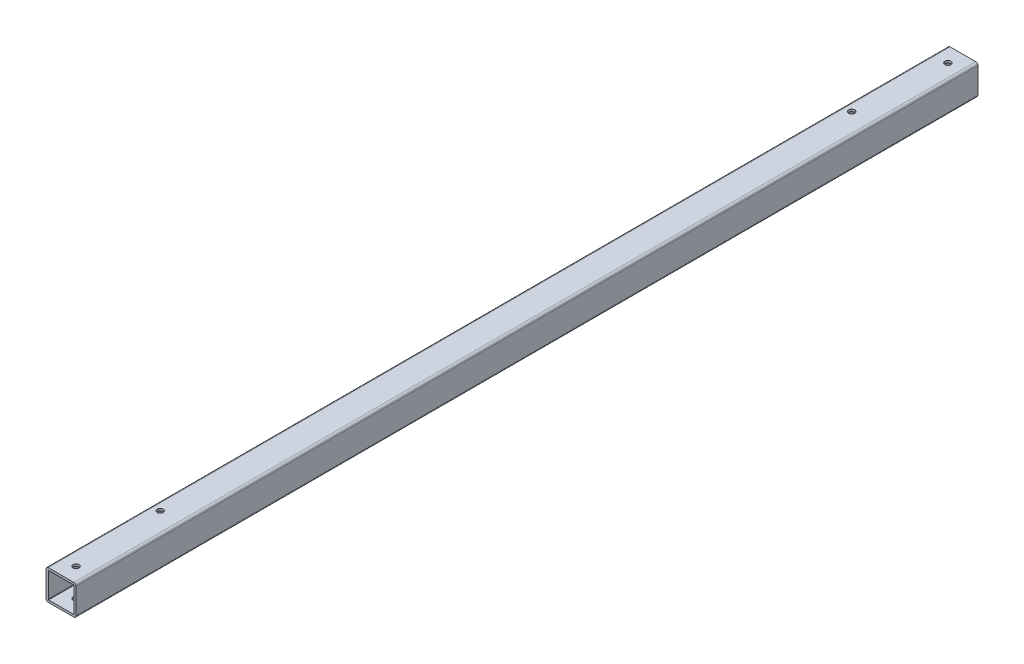
ISO-10303-21;
HEADER;
FILE_DESCRIPTION(('STEP AP214'),'2;1');
FILE_NAME('part.step','',(''),(''),'','','');
FILE_SCHEMA(('AUTOMOTIVE_DESIGN { 1 0 10303 214 1 1 1 1 }'));
ENDSEC;
DATA;
#1=APPLICATION_CONTEXT('core data for automotive mechanical design processes');
#2=APPLICATION_PROTOCOL_DEFINITION('international standard','automotive_design',2000,#1);
#3=PRODUCT_CONTEXT('',#1,'mechanical');
#4=PRODUCT('Part','Part','',(#3));
#5=PRODUCT_RELATED_PRODUCT_CATEGORY('part','',(#4));
#6=PRODUCT_DEFINITION_FORMATION('','',#4);
#7=PRODUCT_DEFINITION_CONTEXT('part definition',#1,'design');
#8=PRODUCT_DEFINITION('design','',#6,#7);
#9=PRODUCT_DEFINITION_SHAPE('','',#8);
#10=(LENGTH_UNIT() NAMED_UNIT(*) SI_UNIT(.MILLI.,.METRE.));
#11=(NAMED_UNIT(*) PLANE_ANGLE_UNIT() SI_UNIT($,.RADIAN.));
#12=(NAMED_UNIT(*) SI_UNIT($,.STERADIAN.) SOLID_ANGLE_UNIT());
#13=UNCERTAINTY_MEASURE_WITH_UNIT(LENGTH_MEASURE(1.E-05),#10,'distance_accuracy_value','');
#14=(GEOMETRIC_REPRESENTATION_CONTEXT(3) GLOBAL_UNCERTAINTY_ASSIGNED_CONTEXT((#13)) GLOBAL_UNIT_ASSIGNED_CONTEXT((#10,
#11,#12)) REPRESENTATION_CONTEXT('',''));
#15=CARTESIAN_POINT('',(0.,0.,0.));
#16=DIRECTION('',(0.,0.,1.));
#17=DIRECTION('',(1.,0.,0.));
#18=AXIS2_PLACEMENT_3D('',#15,#16,#17);
#19=CARTESIAN_POINT('',(-3.33066907387547E-13,0.,1200.));
#20=DIRECTION('',(0.,0.,1.));
#21=DIRECTION('',(1.,0.,0.));
#22=AXIS2_PLACEMENT_3D('',#19,#20,#21);
#23=PLANE('',#22);
#24=DIRECTION('',(1.,0.,0.));
#25=VECTOR('',#24,1.);
#26=CARTESIAN_POINT('',(-20.0000000000002,-20.,1200.));
#27=LINE('',#26,#25);
#28=CARTESIAN_POINT('',(-17.0000000000003,-20.,1200.));
#29=VERTEX_POINT('',#28);
#30=CARTESIAN_POINT('',(16.9999999999997,-20.,1200.));
#31=VERTEX_POINT('',#30);
#32=EDGE_CURVE('E210',#29,#31,#27,.T.);
#33=ORIENTED_EDGE('',*,*,#32,.T.);
#34=CARTESIAN_POINT('',(16.9999999999997,-17.,1200.));
#35=DIRECTION('',(0.,0.,1.));
#36=DIRECTION('',(1.,0.,0.));
#37=AXIS2_PLACEMENT_3D('',#34,#35,#36);
#38=CIRCLE('',#37,3.);
#39=CARTESIAN_POINT('',(19.9999999999997,-17.,1200.));
#40=VERTEX_POINT('',#39);
#41=EDGE_CURVE('E269',#31,#40,#38,.T.);
#42=ORIENTED_EDGE('',*,*,#41,.T.);
#43=DIRECTION('',(0.,1.,0.));
#44=VECTOR('',#43,1.);
#45=CARTESIAN_POINT('',(19.9999999999997,20.,1200.));
#46=LINE('',#45,#44);
#47=CARTESIAN_POINT('',(19.9999999999997,17.,1200.));
#48=VERTEX_POINT('',#47);
#49=EDGE_CURVE('E288',#40,#48,#46,.T.);
#50=ORIENTED_EDGE('',*,*,#49,.T.);
#51=CARTESIAN_POINT('',(16.9999999999997,17.,1200.));
#52=DIRECTION('',(0.,0.,1.));
#53=DIRECTION('',(1.,0.,0.));
#54=AXIS2_PLACEMENT_3D('',#51,#52,#53);
#55=CIRCLE('',#54,3.);
#56=CARTESIAN_POINT('',(16.9999999999997,20.,1200.));
#57=VERTEX_POINT('',#56);
#58=EDGE_CURVE('E265',#48,#57,#55,.T.);
#59=ORIENTED_EDGE('',*,*,#58,.T.);
#60=DIRECTION('',(-1.,0.,0.));
#61=VECTOR('',#60,1.);
#62=CARTESIAN_POINT('',(-20.0000000000004,20.,1200.));
#63=LINE('',#62,#61);
#64=CARTESIAN_POINT('',(-17.0000000000003,20.,1200.));
#65=VERTEX_POINT('',#64);
#66=EDGE_CURVE('E280',#57,#65,#63,.T.);
#67=ORIENTED_EDGE('',*,*,#66,.T.);
#68=CARTESIAN_POINT('',(-17.0000000000003,17.,1200.));
#69=DIRECTION('',(0.,0.,1.));
#70=DIRECTION('',(1.,0.,0.));
#71=AXIS2_PLACEMENT_3D('',#68,#69,#70);
#72=CIRCLE('',#71,3.);
#73=CARTESIAN_POINT('',(-20.0000000000004,17.,1200.));
#74=VERTEX_POINT('',#73);
#75=EDGE_CURVE('E91',#65,#74,#72,.T.);
#76=ORIENTED_EDGE('',*,*,#75,.T.);
#77=DIRECTION('',(0.,-1.,0.));
#78=VECTOR('',#77,1.);
#79=CARTESIAN_POINT('',(-20.0000000000004,20.,1200.));
#80=LINE('',#79,#78);
#81=CARTESIAN_POINT('',(-20.0000000000002,-17.,1200.));
#82=VERTEX_POINT('',#81);
#83=EDGE_CURVE('E215',#74,#82,#80,.T.);
#84=ORIENTED_EDGE('',*,*,#83,.T.);
#85=CARTESIAN_POINT('',(-17.0000000000003,-17.,1200.));
#86=DIRECTION('',(0.,0.,1.));
#87=DIRECTION('',(1.,0.,0.));
#88=AXIS2_PLACEMENT_3D('',#85,#86,#87);
#89=CIRCLE('',#88,3.);
#90=EDGE_CURVE('E267',#82,#29,#89,.T.);
#91=ORIENTED_EDGE('',*,*,#90,.T.);
#92=EDGE_LOOP('',(#33,#42,#50,#59,#67,#76,#84,#91));
#93=FACE_BOUND('',#92,.T.);
#94=DIRECTION('',(-1.,0.,0.));
#95=VECTOR('',#94,1.);
#96=CARTESIAN_POINT('',(-20.0000000000004,17.,1200.));
#97=LINE('',#96,#95);
#98=CARTESIAN_POINT('',(16.4999999999997,17.,1200.));
#99=VERTEX_POINT('',#98);
#100=CARTESIAN_POINT('',(-16.5000000000003,17.,1200.));
#101=VERTEX_POINT('',#100);
#102=EDGE_CURVE('E317',#99,#101,#97,.T.);
#103=ORIENTED_EDGE('',*,*,#102,.F.);
#104=CARTESIAN_POINT('',(16.4999999999997,16.5,1200.));
#105=DIRECTION('',(0.,0.,1.));
#106=DIRECTION('',(1.,0.,0.));
#107=AXIS2_PLACEMENT_3D('',#104,#105,#106);
#108=CIRCLE('',#107,0.5);
#109=CARTESIAN_POINT('',(16.9999999999997,16.5,1200.));
#110=VERTEX_POINT('',#109);
#111=EDGE_CURVE('E240',#99,#110,#108,.F.);
#112=ORIENTED_EDGE('',*,*,#111,.T.);
#113=DIRECTION('',(0.,1.,0.));
#114=VECTOR('',#113,1.);
#115=CARTESIAN_POINT('',(16.9999999999997,20.,1200.));
#116=LINE('',#115,#114);
#117=CARTESIAN_POINT('',(16.9999999999997,-16.5,1200.));
#118=VERTEX_POINT('',#117);
#119=EDGE_CURVE('E306',#118,#110,#116,.T.);
#120=ORIENTED_EDGE('',*,*,#119,.F.);
#121=CARTESIAN_POINT('',(16.4999999999997,-16.5,1200.));
#122=DIRECTION('',(0.,0.,1.));
#123=DIRECTION('',(1.,0.,0.));
#124=AXIS2_PLACEMENT_3D('',#121,#122,#123);
#125=CIRCLE('',#124,0.5);
#126=CARTESIAN_POINT('',(16.4999999999997,-17.,1200.));
#127=VERTEX_POINT('',#126);
#128=EDGE_CURVE('E244',#118,#127,#125,.F.);
#129=ORIENTED_EDGE('',*,*,#128,.T.);
#130=DIRECTION('',(1.,0.,0.));
#131=VECTOR('',#130,1.);
#132=CARTESIAN_POINT('',(-20.0000000000002,-17.,1200.));
#133=LINE('',#132,#131);
#134=CARTESIAN_POINT('',(-16.5000000000003,-17.,1200.));
#135=VERTEX_POINT('',#134);
#136=EDGE_CURVE('E302',#135,#127,#133,.T.);
#137=ORIENTED_EDGE('',*,*,#136,.F.);
#138=CARTESIAN_POINT('',(-16.5000000000003,-16.5,1200.));
#139=DIRECTION('',(0.,0.,1.));
#140=DIRECTION('',(1.,0.,0.));
#141=AXIS2_PLACEMENT_3D('',#138,#139,#140);
#142=CIRCLE('',#141,0.5);
#143=CARTESIAN_POINT('',(-17.0000000000003,-16.5,1200.));
#144=VERTEX_POINT('',#143);
#145=EDGE_CURVE('E196',#135,#144,#142,.F.);
#146=ORIENTED_EDGE('',*,*,#145,.T.);
#147=DIRECTION('',(0.,-1.,0.));
#148=VECTOR('',#147,1.);
#149=CARTESIAN_POINT('',(-17.0000000000003,20.,1200.));
#150=LINE('',#149,#148);
#151=CARTESIAN_POINT('',(-17.0000000000003,16.5,1200.));
#152=VERTEX_POINT('',#151);
#153=EDGE_CURVE('E315',#152,#144,#150,.T.);
#154=ORIENTED_EDGE('',*,*,#153,.F.);
#155=CARTESIAN_POINT('',(-16.5000000000003,16.5,1200.));
#156=DIRECTION('',(0.,0.,1.));
#157=DIRECTION('',(1.,0.,0.));
#158=AXIS2_PLACEMENT_3D('',#155,#156,#157);
#159=CIRCLE('',#158,0.5);
#160=EDGE_CURVE('E195',#152,#101,#159,.F.);
#161=ORIENTED_EDGE('',*,*,#160,.T.);
#162=EDGE_LOOP('',(#103,#112,#120,#129,#137,#146,#154,#161));
#163=FACE_BOUND('',#162,.T.);
#164=ADVANCED_FACE('F68',(#93,#163),#23,.T.);
#165=CARTESIAN_POINT('',(0.,0.,0.));
#166=DIRECTION('',(0.,0.,1.));
#167=DIRECTION('',(1.,0.,0.));
#168=AXIS2_PLACEMENT_3D('',#165,#166,#167);
#169=PLANE('',#168);
#170=DIRECTION('',(0.,1.,0.));
#171=VECTOR('',#170,1.);
#172=CARTESIAN_POINT('',(20.,20.,0.));
#173=LINE('',#172,#171);
#174=CARTESIAN_POINT('',(20.,-17.,0.));
#175=VERTEX_POINT('',#174);
#176=CARTESIAN_POINT('',(20.,17.,0.));
#177=VERTEX_POINT('',#176);
#178=EDGE_CURVE('E298',#175,#177,#173,.T.);
#179=ORIENTED_EDGE('',*,*,#178,.F.);
#180=CARTESIAN_POINT('',(17.,-17.,0.));
#181=DIRECTION('',(0.,0.,1.));
#182=DIRECTION('',(1.,0.,0.));
#183=AXIS2_PLACEMENT_3D('',#180,#181,#182);
#184=CIRCLE('',#183,3.);
#185=CARTESIAN_POINT('',(17.,-20.,0.));
#186=VERTEX_POINT('',#185);
#187=EDGE_CURVE('E257',#175,#186,#184,.F.);
#188=ORIENTED_EDGE('',*,*,#187,.T.);
#189=DIRECTION('',(1.,0.,0.));
#190=VECTOR('',#189,1.);
#191=CARTESIAN_POINT('',(-20.,-20.,0.));
#192=LINE('',#191,#190);
#193=CARTESIAN_POINT('',(-17.,-20.,0.));
#194=VERTEX_POINT('',#193);
#195=EDGE_CURVE('E218',#194,#186,#192,.T.);
#196=ORIENTED_EDGE('',*,*,#195,.F.);
#197=CARTESIAN_POINT('',(-17.,-17.,0.));
#198=DIRECTION('',(0.,0.,1.));
#199=DIRECTION('',(1.,0.,0.));
#200=AXIS2_PLACEMENT_3D('',#197,#198,#199);
#201=CIRCLE('',#200,3.);
#202=CARTESIAN_POINT('',(-20.,-17.,0.));
#203=VERTEX_POINT('',#202);
#204=EDGE_CURVE('E255',#194,#203,#201,.F.);
#205=ORIENTED_EDGE('',*,*,#204,.T.);
#206=DIRECTION('',(0.,-1.,0.));
#207=VECTOR('',#206,1.);
#208=CARTESIAN_POINT('',(-20.,20.,0.));
#209=LINE('',#208,#207);
#210=CARTESIAN_POINT('',(-20.,17.,0.));
#211=VERTEX_POINT('',#210);
#212=EDGE_CURVE('E293',#211,#203,#209,.T.);
#213=ORIENTED_EDGE('',*,*,#212,.F.);
#214=CARTESIAN_POINT('',(-17.,17.,0.));
#215=DIRECTION('',(0.,0.,1.));
#216=DIRECTION('',(1.,0.,0.));
#217=AXIS2_PLACEMENT_3D('',#214,#215,#216);
#218=CIRCLE('',#217,3.);
#219=CARTESIAN_POINT('',(-17.,20.,0.));
#220=VERTEX_POINT('',#219);
#221=EDGE_CURVE('E251',#211,#220,#218,.F.);
#222=ORIENTED_EDGE('',*,*,#221,.T.);
#223=DIRECTION('',(-1.,0.,0.));
#224=VECTOR('',#223,1.);
#225=CARTESIAN_POINT('',(-20.,20.,0.));
#226=LINE('',#225,#224);
#227=CARTESIAN_POINT('',(17.,20.,0.));
#228=VERTEX_POINT('',#227);
#229=EDGE_CURVE('E283',#228,#220,#226,.T.);
#230=ORIENTED_EDGE('',*,*,#229,.F.);
#231=CARTESIAN_POINT('',(17.,17.,0.));
#232=DIRECTION('',(0.,0.,1.));
#233=DIRECTION('',(1.,0.,0.));
#234=AXIS2_PLACEMENT_3D('',#231,#232,#233);
#235=CIRCLE('',#234,3.);
#236=EDGE_CURVE('E253',#228,#177,#235,.F.);
#237=ORIENTED_EDGE('',*,*,#236,.T.);
#238=EDGE_LOOP('',(#179,#188,#196,#205,#213,#222,#230,#237));
#239=FACE_BOUND('',#238,.T.);
#240=DIRECTION('',(1.,0.,0.));
#241=VECTOR('',#240,1.);
#242=CARTESIAN_POINT('',(-20.,-17.,0.));
#243=LINE('',#242,#241);
#244=CARTESIAN_POINT('',(-16.5,-17.,0.));
#245=VERTEX_POINT('',#244);
#246=CARTESIAN_POINT('',(16.5,-17.,0.));
#247=VERTEX_POINT('',#246);
#248=EDGE_CURVE('E206',#245,#247,#243,.T.);
#249=ORIENTED_EDGE('',*,*,#248,.T.);
#250=CARTESIAN_POINT('',(16.5,-16.5,0.));
#251=DIRECTION('',(0.,0.,1.));
#252=DIRECTION('',(1.,0.,0.));
#253=AXIS2_PLACEMENT_3D('',#250,#251,#252);
#254=CIRCLE('',#253,0.5);
#255=CARTESIAN_POINT('',(17.,-16.5,0.));
#256=VERTEX_POINT('',#255);
#257=EDGE_CURVE('E242',#247,#256,#254,.T.);
#258=ORIENTED_EDGE('',*,*,#257,.T.);
#259=DIRECTION('',(0.,1.,0.));
#260=VECTOR('',#259,1.);
#261=CARTESIAN_POINT('',(17.,20.,0.));
#262=LINE('',#261,#260);
#263=CARTESIAN_POINT('',(17.,16.5,0.));
#264=VERTEX_POINT('',#263);
#265=EDGE_CURVE('E309',#256,#264,#262,.T.);
#266=ORIENTED_EDGE('',*,*,#265,.T.);
#267=CARTESIAN_POINT('',(16.5,16.5,0.));
#268=DIRECTION('',(0.,0.,1.));
#269=DIRECTION('',(1.,0.,0.));
#270=AXIS2_PLACEMENT_3D('',#267,#268,#269);
#271=CIRCLE('',#270,0.5);
#272=CARTESIAN_POINT('',(16.5,17.,0.));
#273=VERTEX_POINT('',#272);
#274=EDGE_CURVE('E238',#264,#273,#271,.T.);
#275=ORIENTED_EDGE('',*,*,#274,.T.);
#276=DIRECTION('',(-1.,0.,0.));
#277=VECTOR('',#276,1.);
#278=CARTESIAN_POINT('',(-20.,17.,0.));
#279=LINE('',#278,#277);
#280=CARTESIAN_POINT('',(-16.5,17.,0.));
#281=VERTEX_POINT('',#280);
#282=EDGE_CURVE('E190',#273,#281,#279,.T.);
#283=ORIENTED_EDGE('',*,*,#282,.T.);
#284=CARTESIAN_POINT('',(-16.5,16.5,0.));
#285=DIRECTION('',(0.,0.,1.));
#286=DIRECTION('',(1.,0.,0.));
#287=AXIS2_PLACEMENT_3D('',#284,#285,#286);
#288=CIRCLE('',#287,0.5);
#289=CARTESIAN_POINT('',(-17.,16.5,0.));
#290=VERTEX_POINT('',#289);
#291=EDGE_CURVE('E184',#281,#290,#288,.T.);
#292=ORIENTED_EDGE('',*,*,#291,.T.);
#293=DIRECTION('',(0.,-1.,0.));
#294=VECTOR('',#293,1.);
#295=CARTESIAN_POINT('',(-17.,20.,0.));
#296=LINE('',#295,#294);
#297=CARTESIAN_POINT('',(-17.,-16.5,0.));
#298=VERTEX_POINT('',#297);
#299=EDGE_CURVE('E188',#290,#298,#296,.T.);
#300=ORIENTED_EDGE('',*,*,#299,.T.);
#301=CARTESIAN_POINT('',(-16.5,-16.5,0.));
#302=DIRECTION('',(0.,0.,1.));
#303=DIRECTION('',(1.,0.,0.));
#304=AXIS2_PLACEMENT_3D('',#301,#302,#303);
#305=CIRCLE('',#304,0.5);
#306=EDGE_CURVE('E234',#298,#245,#305,.T.);
#307=ORIENTED_EDGE('',*,*,#306,.T.);
#308=EDGE_LOOP('',(#249,#258,#266,#275,#283,#292,#300,#307));
#309=FACE_BOUND('',#308,.T.);
#310=ADVANCED_FACE('F187',(#239,#309),#169,.F.);
#311=CARTESIAN_POINT('',(19.9999999999997,20.,1200.));
#312=DIRECTION('',(-1.,0.,0.));
#313=DIRECTION('',(0.,-1.,0.));
#314=AXIS2_PLACEMENT_3D('',#311,#312,#313);
#315=PLANE('',#314);
#316=ORIENTED_EDGE('',*,*,#49,.F.);
#317=DIRECTION('',(0.,0.,-1.));
#318=VECTOR('',#317,1.);
#319=CARTESIAN_POINT('',(19.9999999999997,-17.,1200.));
#320=LINE('',#319,#318);
#321=EDGE_CURVE('E248',#40,#175,#320,.T.);
#322=ORIENTED_EDGE('',*,*,#321,.T.);
#323=ORIENTED_EDGE('',*,*,#178,.T.);
#324=DIRECTION('',(0.,0.,-1.));
#325=VECTOR('',#324,1.);
#326=CARTESIAN_POINT('',(19.9999999999997,17.,1200.));
#327=LINE('',#326,#325);
#328=EDGE_CURVE('E246',#177,#48,#327,.F.);
#329=ORIENTED_EDGE('',*,*,#328,.T.);
#330=EDGE_LOOP('',(#316,#322,#323,#329));
#331=FACE_BOUND('',#330,.T.);
#332=ADVANCED_FACE('F371',(#331),#315,.F.);
#333=CARTESIAN_POINT('',(-20.0000000000004,20.,1200.));
#334=DIRECTION('',(0.,-1.,0.));
#335=DIRECTION('',(0.,0.,-1.));
#336=AXIS2_PLACEMENT_3D('',#333,#334,#335);
#337=PLANE('',#336);
#338=CARTESIAN_POINT('',(-8.00000000000034,20.,1060.));
#339=DIRECTION('',(0.,1.,0.));
#340=DIRECTION('',(0.,0.,1.));
#341=AXIS2_PLACEMENT_3D('',#338,#339,#340);
#342=CIRCLE('',#341,3.99999999999999);
#343=CARTESIAN_POINT('',(-8.00000000000034,20.,1064.));
#344=VERTEX_POINT('',#343);
#345=EDGE_CURVE('E363',#344,#344,#342,.T.);
#346=ORIENTED_EDGE('',*,*,#345,.F.);
#347=EDGE_LOOP('',(#346));
#348=FACE_BOUND('',#347,.T.);
#349=CARTESIAN_POINT('',(-8.00000000000001,20.,140.));
#350=DIRECTION('',(0.,1.,0.));
#351=DIRECTION('',(0.,0.,1.));
#352=AXIS2_PLACEMENT_3D('',#349,#350,#351);
#353=CIRCLE('',#352,3.99999999999999);
#354=CARTESIAN_POINT('',(-8.00000000000001,20.,144.));
#355=VERTEX_POINT('',#354);
#356=EDGE_CURVE('E351',#355,#355,#353,.T.);
#357=ORIENTED_EDGE('',*,*,#356,.F.);
#358=EDGE_LOOP('',(#357));
#359=FACE_BOUND('',#358,.T.);
#360=CARTESIAN_POINT('',(0.,20.,20.));
#361=DIRECTION('',(0.,1.,0.));
#362=DIRECTION('',(0.,0.,1.));
#363=AXIS2_PLACEMENT_3D('',#360,#361,#362);
#364=CIRCLE('',#363,4.);
#365=CARTESIAN_POINT('',(0.,20.,24.));
#366=VERTEX_POINT('',#365);
#367=EDGE_CURVE('E339',#366,#366,#364,.T.);
#368=ORIENTED_EDGE('',*,*,#367,.F.);
#369=EDGE_LOOP('',(#368));
#370=FACE_BOUND('',#369,.T.);
#371=CARTESIAN_POINT('',(-1.11022302462516E-13,20.,1180.));
#372=DIRECTION('',(0.,1.,0.));
#373=DIRECTION('',(0.,0.,1.));
#374=AXIS2_PLACEMENT_3D('',#371,#372,#373);
#375=CIRCLE('',#374,4.);
#376=CARTESIAN_POINT('',(-1.11022302462516E-13,20.,1184.));
#377=VERTEX_POINT('',#376);
#378=EDGE_CURVE('E330',#377,#377,#375,.T.);
#379=ORIENTED_EDGE('',*,*,#378,.F.);
#380=EDGE_LOOP('',(#379));
#381=FACE_BOUND('',#380,.T.);
#382=ORIENTED_EDGE('',*,*,#66,.F.);
#383=DIRECTION('',(0.,0.,-1.));
#384=VECTOR('',#383,1.);
#385=CARTESIAN_POINT('',(16.9999999999997,20.,1200.));
#386=LINE('',#385,#384);
#387=EDGE_CURVE('E14',#57,#228,#386,.T.);
#388=ORIENTED_EDGE('',*,*,#387,.T.);
#389=ORIENTED_EDGE('',*,*,#229,.T.);
#390=DIRECTION('',(0.,0.,-1.));
#391=VECTOR('',#390,1.);
#392=CARTESIAN_POINT('',(-17.0000000000003,20.,1200.));
#393=LINE('',#392,#391);
#394=EDGE_CURVE('E77',#220,#65,#393,.F.);
#395=ORIENTED_EDGE('',*,*,#394,.T.);
#396=EDGE_LOOP('',(#382,#388,#389,#395));
#397=FACE_BOUND('',#396,.T.);
#398=ADVANCED_FACE('F279',(#348,#359,#370,#381,#397),#337,.F.);
#399=CARTESIAN_POINT('',(-20.0000000000004,20.,1200.));
#400=DIRECTION('',(1.,0.,0.));
#401=DIRECTION('',(0.,1.,0.));
#402=AXIS2_PLACEMENT_3D('',#399,#400,#401);
#403=PLANE('',#402);
#404=ORIENTED_EDGE('',*,*,#212,.T.);
#405=DIRECTION('',(0.,0.,-1.));
#406=VECTOR('',#405,1.);
#407=CARTESIAN_POINT('',(-20.0000000000002,-17.,1200.));
#408=LINE('',#407,#406);
#409=EDGE_CURVE('E84',#203,#82,#408,.F.);
#410=ORIENTED_EDGE('',*,*,#409,.T.);
#411=ORIENTED_EDGE('',*,*,#83,.F.);
#412=DIRECTION('',(0.,0.,-1.));
#413=VECTOR('',#412,1.);
#414=CARTESIAN_POINT('',(-20.0000000000004,17.,1200.));
#415=LINE('',#414,#413);
#416=EDGE_CURVE('E271',#74,#211,#415,.T.);
#417=ORIENTED_EDGE('',*,*,#416,.T.);
#418=EDGE_LOOP('',(#404,#410,#411,#417));
#419=FACE_BOUND('',#418,.T.);
#420=ADVANCED_FACE('F292',(#419),#403,.F.);
#421=CARTESIAN_POINT('',(-20.0000000000002,-20.,1200.));
#422=DIRECTION('',(0.,1.,0.));
#423=DIRECTION('',(0.,0.,1.));
#424=AXIS2_PLACEMENT_3D('',#421,#422,#423);
#425=PLANE('',#424);
#426=CARTESIAN_POINT('',(-8.00000000000034,-20.,1060.));
#427=DIRECTION('',(0.,1.,0.));
#428=DIRECTION('',(0.,0.,1.));
#429=AXIS2_PLACEMENT_3D('',#426,#427,#428);
#430=CIRCLE('',#429,3.99999999999999);
#431=CARTESIAN_POINT('',(-8.00000000000034,-20.,1064.));
#432=VERTEX_POINT('',#431);
#433=EDGE_CURVE('E360',#432,#432,#430,.T.);
#434=ORIENTED_EDGE('',*,*,#433,.T.);
#435=EDGE_LOOP('',(#434));
#436=FACE_BOUND('',#435,.T.);
#437=CARTESIAN_POINT('',(-8.00000000000001,-20.,140.));
#438=DIRECTION('',(0.,1.,0.));
#439=DIRECTION('',(0.,0.,1.));
#440=AXIS2_PLACEMENT_3D('',#437,#438,#439);
#441=CIRCLE('',#440,3.99999999999999);
#442=CARTESIAN_POINT('',(-8.00000000000001,-20.,144.));
#443=VERTEX_POINT('',#442);
#444=EDGE_CURVE('E348',#443,#443,#441,.T.);
#445=ORIENTED_EDGE('',*,*,#444,.T.);
#446=EDGE_LOOP('',(#445));
#447=FACE_BOUND('',#446,.T.);
#448=CARTESIAN_POINT('',(0.,-20.,20.));
#449=DIRECTION('',(0.,1.,0.));
#450=DIRECTION('',(0.,0.,1.));
#451=AXIS2_PLACEMENT_3D('',#448,#449,#450);
#452=CIRCLE('',#451,3.99999999999999);
#453=CARTESIAN_POINT('',(0.,-20.,24.));
#454=VERTEX_POINT('',#453);
#455=EDGE_CURVE('E336',#454,#454,#452,.T.);
#456=ORIENTED_EDGE('',*,*,#455,.T.);
#457=EDGE_LOOP('',(#456));
#458=FACE_BOUND('',#457,.T.);
#459=CARTESIAN_POINT('',(-1.11022302462516E-13,-20.,1180.));
#460=DIRECTION('',(0.,1.,0.));
#461=DIRECTION('',(0.,0.,1.));
#462=AXIS2_PLACEMENT_3D('',#459,#460,#461);
#463=CIRCLE('',#462,3.99999999999999);
#464=CARTESIAN_POINT('',(-1.11022302462516E-13,-20.,1184.));
#465=VERTEX_POINT('',#464);
#466=EDGE_CURVE('E327',#465,#465,#463,.T.);
#467=ORIENTED_EDGE('',*,*,#466,.T.);
#468=EDGE_LOOP('',(#467));
#469=FACE_BOUND('',#468,.T.);
#470=ORIENTED_EDGE('',*,*,#195,.T.);
#471=DIRECTION('',(0.,0.,-1.));
#472=VECTOR('',#471,1.);
#473=CARTESIAN_POINT('',(16.9999999999997,-20.,1200.));
#474=LINE('',#473,#472);
#475=EDGE_CURVE('E262',#186,#31,#474,.F.);
#476=ORIENTED_EDGE('',*,*,#475,.T.);
#477=ORIENTED_EDGE('',*,*,#32,.F.);
#478=DIRECTION('',(0.,0.,-1.));
#479=VECTOR('',#478,1.);
#480=CARTESIAN_POINT('',(-17.0000000000003,-20.,1200.));
#481=LINE('',#480,#479);
#482=EDGE_CURVE('E259',#29,#194,#481,.T.);
#483=ORIENTED_EDGE('',*,*,#482,.T.);
#484=EDGE_LOOP('',(#470,#476,#477,#483));
#485=FACE_BOUND('',#484,.T.);
#486=ADVANCED_FACE('F404',(#436,#447,#458,#469,#485),#425,.F.);
#487=CARTESIAN_POINT('',(16.9999999999997,20.,1200.));
#488=DIRECTION('',(-1.,0.,0.));
#489=DIRECTION('',(0.,-1.,0.));
#490=AXIS2_PLACEMENT_3D('',#487,#488,#489);
#491=PLANE('',#490);
#492=ORIENTED_EDGE('',*,*,#119,.T.);
#493=DIRECTION('',(0.,0.,-1.));
#494=VECTOR('',#493,1.);
#495=CARTESIAN_POINT('',(17.,16.5,0.));
#496=LINE('',#495,#494);
#497=EDGE_CURVE('E231',#110,#264,#496,.T.);
#498=ORIENTED_EDGE('',*,*,#497,.T.);
#499=ORIENTED_EDGE('',*,*,#265,.F.);
#500=DIRECTION('',(0.,0.,-1.));
#501=VECTOR('',#500,1.);
#502=CARTESIAN_POINT('',(16.9999999999997,-16.5,1200.));
#503=LINE('',#502,#501);
#504=EDGE_CURVE('E229',#256,#118,#503,.F.);
#505=ORIENTED_EDGE('',*,*,#504,.T.);
#506=EDGE_LOOP('',(#492,#498,#499,#505));
#507=FACE_BOUND('',#506,.T.);
#508=ADVANCED_FACE('F401',(#507),#491,.T.);
#509=CARTESIAN_POINT('',(-20.0000000000004,17.,1200.));
#510=DIRECTION('',(0.,-1.,0.));
#511=DIRECTION('',(0.,0.,-1.));
#512=AXIS2_PLACEMENT_3D('',#509,#510,#511);
#513=PLANE('',#512);
#514=CARTESIAN_POINT('',(-8.00000000000034,17.,1060.));
#515=DIRECTION('',(0.,-1.,0.));
#516=DIRECTION('',(0.,0.,-1.));
#517=AXIS2_PLACEMENT_3D('',#514,#515,#516);
#518=CIRCLE('',#517,3.99999999999999);
#519=CARTESIAN_POINT('',(-8.00000000000034,17.,1056.));
#520=VERTEX_POINT('',#519);
#521=EDGE_CURVE('E354',#520,#520,#518,.T.);
#522=ORIENTED_EDGE('',*,*,#521,.F.);
#523=EDGE_LOOP('',(#522));
#524=FACE_BOUND('',#523,.T.);
#525=CARTESIAN_POINT('',(-8.00000000000001,17.,140.));
#526=DIRECTION('',(0.,-1.,0.));
#527=DIRECTION('',(0.,0.,-1.));
#528=AXIS2_PLACEMENT_3D('',#525,#526,#527);
#529=CIRCLE('',#528,3.99999999999999);
#530=CARTESIAN_POINT('',(-8.00000000000001,17.,136.));
#531=VERTEX_POINT('',#530);
#532=EDGE_CURVE('E342',#531,#531,#529,.T.);
#533=ORIENTED_EDGE('',*,*,#532,.F.);
#534=EDGE_LOOP('',(#533));
#535=FACE_BOUND('',#534,.T.);
#536=CARTESIAN_POINT('',(0.,17.,20.));
#537=DIRECTION('',(0.,-1.,0.));
#538=DIRECTION('',(0.,0.,-1.));
#539=AXIS2_PLACEMENT_3D('',#536,#537,#538);
#540=CIRCLE('',#539,4.);
#541=CARTESIAN_POINT('',(0.,17.,16.));
#542=VERTEX_POINT('',#541);
#543=EDGE_CURVE('E72',#542,#542,#540,.T.);
#544=ORIENTED_EDGE('',*,*,#543,.F.);
#545=EDGE_LOOP('',(#544));
#546=FACE_BOUND('',#545,.T.);
#547=CARTESIAN_POINT('',(-1.11022302462516E-13,17.,1180.));
#548=DIRECTION('',(0.,-1.,0.));
#549=DIRECTION('',(0.,0.,-1.));
#550=AXIS2_PLACEMENT_3D('',#547,#548,#549);
#551=CIRCLE('',#550,4.);
#552=CARTESIAN_POINT('',(-1.11022302462516E-13,17.,1176.));
#553=VERTEX_POINT('',#552);
#554=EDGE_CURVE('E324',#553,#553,#551,.T.);
#555=ORIENTED_EDGE('',*,*,#554,.F.);
#556=EDGE_LOOP('',(#555));
#557=FACE_BOUND('',#556,.T.);
#558=ORIENTED_EDGE('',*,*,#102,.T.);
#559=DIRECTION('',(0.,0.,-1.));
#560=VECTOR('',#559,1.);
#561=CARTESIAN_POINT('',(-16.5,17.,0.));
#562=LINE('',#561,#560);
#563=EDGE_CURVE('E227',#101,#281,#562,.T.);
#564=ORIENTED_EDGE('',*,*,#563,.T.);
#565=ORIENTED_EDGE('',*,*,#282,.F.);
#566=DIRECTION('',(0.,0.,-1.));
#567=VECTOR('',#566,1.);
#568=CARTESIAN_POINT('',(16.4999999999997,17.,1200.));
#569=LINE('',#568,#567);
#570=EDGE_CURVE('E225',#273,#99,#569,.F.);
#571=ORIENTED_EDGE('',*,*,#570,.T.);
#572=EDGE_LOOP('',(#558,#564,#565,#571));
#573=FACE_BOUND('',#572,.T.);
#574=ADVANCED_FACE('F535',(#524,#535,#546,#557,#573),#513,.T.);
#575=CARTESIAN_POINT('',(-17.0000000000003,20.,1200.));
#576=DIRECTION('',(1.,0.,0.));
#577=DIRECTION('',(0.,1.,0.));
#578=AXIS2_PLACEMENT_3D('',#575,#576,#577);
#579=PLANE('',#578);
#580=ORIENTED_EDGE('',*,*,#153,.T.);
#581=DIRECTION('',(0.,0.,-1.));
#582=VECTOR('',#581,1.);
#583=CARTESIAN_POINT('',(-17.,-16.5,0.));
#584=LINE('',#583,#582);
#585=EDGE_CURVE('E205',#144,#298,#584,.T.);
#586=ORIENTED_EDGE('',*,*,#585,.T.);
#587=ORIENTED_EDGE('',*,*,#299,.F.);
#588=DIRECTION('',(0.,0.,-1.));
#589=VECTOR('',#588,1.);
#590=CARTESIAN_POINT('',(-17.0000000000003,16.5,1200.));
#591=LINE('',#590,#589);
#592=EDGE_CURVE('E202',#290,#152,#591,.F.);
#593=ORIENTED_EDGE('',*,*,#592,.T.);
#594=EDGE_LOOP('',(#580,#586,#587,#593));
#595=FACE_BOUND('',#594,.T.);
#596=ADVANCED_FACE('F201',(#595),#579,.T.);
#597=CARTESIAN_POINT('',(-20.0000000000002,-17.,1200.));
#598=DIRECTION('',(0.,1.,0.));
#599=DIRECTION('',(0.,0.,1.));
#600=AXIS2_PLACEMENT_3D('',#597,#598,#599);
#601=PLANE('',#600);
#602=CARTESIAN_POINT('',(-8.00000000000034,-17.,1060.));
#603=DIRECTION('',(0.,1.,0.));
#604=DIRECTION('',(0.,0.,1.));
#605=AXIS2_PLACEMENT_3D('',#602,#603,#604);
#606=CIRCLE('',#605,3.99999999999999);
#607=CARTESIAN_POINT('',(-8.00000000000034,-17.,1064.));
#608=VERTEX_POINT('',#607);
#609=EDGE_CURVE('E357',#608,#608,#606,.T.);
#610=ORIENTED_EDGE('',*,*,#609,.F.);
#611=EDGE_LOOP('',(#610));
#612=FACE_BOUND('',#611,.T.);
#613=CARTESIAN_POINT('',(-8.00000000000001,-17.,140.));
#614=DIRECTION('',(0.,1.,0.));
#615=DIRECTION('',(0.,0.,1.));
#616=AXIS2_PLACEMENT_3D('',#613,#614,#615);
#617=CIRCLE('',#616,3.99999999999999);
#618=CARTESIAN_POINT('',(-8.00000000000001,-17.,144.));
#619=VERTEX_POINT('',#618);
#620=EDGE_CURVE('E345',#619,#619,#617,.T.);
#621=ORIENTED_EDGE('',*,*,#620,.F.);
#622=EDGE_LOOP('',(#621));
#623=FACE_BOUND('',#622,.T.);
#624=CARTESIAN_POINT('',(0.,-17.,20.));
#625=DIRECTION('',(0.,1.,0.));
#626=DIRECTION('',(0.,0.,1.));
#627=AXIS2_PLACEMENT_3D('',#624,#625,#626);
#628=CIRCLE('',#627,4.);
#629=CARTESIAN_POINT('',(0.,-17.,24.));
#630=VERTEX_POINT('',#629);
#631=EDGE_CURVE('E333',#630,#630,#628,.T.);
#632=ORIENTED_EDGE('',*,*,#631,.F.);
#633=EDGE_LOOP('',(#632));
#634=FACE_BOUND('',#633,.T.);
#635=CARTESIAN_POINT('',(-1.11022302462516E-13,-17.,1180.));
#636=DIRECTION('',(0.,1.,0.));
#637=DIRECTION('',(0.,0.,1.));
#638=AXIS2_PLACEMENT_3D('',#635,#636,#637);
#639=CIRCLE('',#638,4.);
#640=CARTESIAN_POINT('',(-1.11022302462516E-13,-17.,1184.));
#641=VERTEX_POINT('',#640);
#642=EDGE_CURVE('E312',#641,#641,#639,.T.);
#643=ORIENTED_EDGE('',*,*,#642,.F.);
#644=EDGE_LOOP('',(#643));
#645=FACE_BOUND('',#644,.T.);
#646=ORIENTED_EDGE('',*,*,#248,.F.);
#647=DIRECTION('',(0.,0.,-1.));
#648=VECTOR('',#647,1.);
#649=CARTESIAN_POINT('',(-16.5000000000003,-17.,1200.));
#650=LINE('',#649,#648);
#651=EDGE_CURVE('E223',#245,#135,#650,.F.);
#652=ORIENTED_EDGE('',*,*,#651,.T.);
#653=ORIENTED_EDGE('',*,*,#136,.T.);
#654=DIRECTION('',(0.,0.,-1.));
#655=VECTOR('',#654,1.);
#656=CARTESIAN_POINT('',(16.5,-17.,0.));
#657=LINE('',#656,#655);
#658=EDGE_CURVE('E212',#127,#247,#657,.T.);
#659=ORIENTED_EDGE('',*,*,#658,.T.);
#660=EDGE_LOOP('',(#646,#652,#653,#659));
#661=FACE_BOUND('',#660,.T.);
#662=ADVANCED_FACE('F416',(#612,#623,#634,#645,#661),#601,.T.);
#663=CARTESIAN_POINT('',(-16.5000000000003,-16.5,1200.));
#664=DIRECTION('',(0.,0.,1.));
#665=DIRECTION('',(1.,0.,0.));
#666=AXIS2_PLACEMENT_3D('',#663,#664,#665);
#667=CYLINDRICAL_SURFACE('',#666,0.5);
#668=ORIENTED_EDGE('',*,*,#145,.F.);
#669=ORIENTED_EDGE('',*,*,#651,.F.);
#670=ORIENTED_EDGE('',*,*,#306,.F.);
#671=ORIENTED_EDGE('',*,*,#585,.F.);
#672=EDGE_LOOP('',(#668,#669,#670,#671));
#673=FACE_BOUND('',#672,.T.);
#674=ADVANCED_FACE('F413',(#673),#667,.F.);
#675=CARTESIAN_POINT('',(-16.5000000000003,16.5,1200.));
#676=DIRECTION('',(0.,0.,1.));
#677=DIRECTION('',(1.,0.,0.));
#678=AXIS2_PLACEMENT_3D('',#675,#676,#677);
#679=CYLINDRICAL_SURFACE('',#678,0.5);
#680=ORIENTED_EDGE('',*,*,#160,.F.);
#681=ORIENTED_EDGE('',*,*,#592,.F.);
#682=ORIENTED_EDGE('',*,*,#291,.F.);
#683=ORIENTED_EDGE('',*,*,#563,.F.);
#684=EDGE_LOOP('',(#680,#681,#682,#683));
#685=FACE_BOUND('',#684,.T.);
#686=ADVANCED_FACE('F209',(#685),#679,.F.);
#687=CARTESIAN_POINT('',(16.4999999999997,16.5,1200.));
#688=DIRECTION('',(0.,0.,1.));
#689=DIRECTION('',(1.,0.,0.));
#690=AXIS2_PLACEMENT_3D('',#687,#688,#689);
#691=CYLINDRICAL_SURFACE('',#690,0.5);
#692=ORIENTED_EDGE('',*,*,#111,.F.);
#693=ORIENTED_EDGE('',*,*,#570,.F.);
#694=ORIENTED_EDGE('',*,*,#274,.F.);
#695=ORIENTED_EDGE('',*,*,#497,.F.);
#696=EDGE_LOOP('',(#692,#693,#694,#695));
#697=FACE_BOUND('',#696,.T.);
#698=ADVANCED_FACE('F420',(#697),#691,.F.);
#699=CARTESIAN_POINT('',(16.4999999999997,-16.5,1200.));
#700=DIRECTION('',(0.,0.,1.));
#701=DIRECTION('',(1.,0.,0.));
#702=AXIS2_PLACEMENT_3D('',#699,#700,#701);
#703=CYLINDRICAL_SURFACE('',#702,0.5);
#704=ORIENTED_EDGE('',*,*,#128,.F.);
#705=ORIENTED_EDGE('',*,*,#504,.F.);
#706=ORIENTED_EDGE('',*,*,#257,.F.);
#707=ORIENTED_EDGE('',*,*,#658,.F.);
#708=EDGE_LOOP('',(#704,#705,#706,#707));
#709=FACE_BOUND('',#708,.T.);
#710=ADVANCED_FACE('F423',(#709),#703,.F.);
#711=CARTESIAN_POINT('',(16.9999999999997,-17.,1200.));
#712=DIRECTION('',(0.,0.,-1.));
#713=DIRECTION('',(-1.,0.,0.));
#714=AXIS2_PLACEMENT_3D('',#711,#712,#713);
#715=CYLINDRICAL_SURFACE('',#714,3.);
#716=ORIENTED_EDGE('',*,*,#41,.F.);
#717=ORIENTED_EDGE('',*,*,#475,.F.);
#718=ORIENTED_EDGE('',*,*,#187,.F.);
#719=ORIENTED_EDGE('',*,*,#321,.F.);
#720=EDGE_LOOP('',(#716,#717,#718,#719));
#721=FACE_BOUND('',#720,.T.);
#722=ADVANCED_FACE('F427',(#721),#715,.T.);
#723=CARTESIAN_POINT('',(-17.0000000000003,-17.,1200.));
#724=DIRECTION('',(0.,0.,-1.));
#725=DIRECTION('',(-1.,0.,0.));
#726=AXIS2_PLACEMENT_3D('',#723,#724,#725);
#727=CYLINDRICAL_SURFACE('',#726,3.);
#728=ORIENTED_EDGE('',*,*,#90,.F.);
#729=ORIENTED_EDGE('',*,*,#409,.F.);
#730=ORIENTED_EDGE('',*,*,#204,.F.);
#731=ORIENTED_EDGE('',*,*,#482,.F.);
#732=EDGE_LOOP('',(#728,#729,#730,#731));
#733=FACE_BOUND('',#732,.T.);
#734=ADVANCED_FACE('F431',(#733),#727,.T.);
#735=CARTESIAN_POINT('',(16.9999999999997,17.,1200.));
#736=DIRECTION('',(0.,0.,-1.));
#737=DIRECTION('',(-1.,0.,0.));
#738=AXIS2_PLACEMENT_3D('',#735,#736,#737);
#739=CYLINDRICAL_SURFACE('',#738,3.);
#740=ORIENTED_EDGE('',*,*,#58,.F.);
#741=ORIENTED_EDGE('',*,*,#328,.F.);
#742=ORIENTED_EDGE('',*,*,#236,.F.);
#743=ORIENTED_EDGE('',*,*,#387,.F.);
#744=EDGE_LOOP('',(#740,#741,#742,#743));
#745=FACE_BOUND('',#744,.T.);
#746=ADVANCED_FACE('F434',(#745),#739,.T.);
#747=CARTESIAN_POINT('',(-17.0000000000003,17.,1200.));
#748=DIRECTION('',(0.,0.,-1.));
#749=DIRECTION('',(-1.,0.,0.));
#750=AXIS2_PLACEMENT_3D('',#747,#748,#749);
#751=CYLINDRICAL_SURFACE('',#750,3.);
#752=ORIENTED_EDGE('',*,*,#75,.F.);
#753=ORIENTED_EDGE('',*,*,#394,.F.);
#754=ORIENTED_EDGE('',*,*,#221,.F.);
#755=ORIENTED_EDGE('',*,*,#416,.F.);
#756=EDGE_LOOP('',(#752,#753,#754,#755));
#757=FACE_BOUND('',#756,.T.);
#758=ADVANCED_FACE('F70',(#757),#751,.T.);
#759=CARTESIAN_POINT('',(-1.11022302462516E-13,20.,1180.));
#760=DIRECTION('',(0.,1.,0.));
#761=DIRECTION('',(0.,0.,1.));
#762=AXIS2_PLACEMENT_3D('',#759,#760,#761);
#763=CYLINDRICAL_SURFACE('',#762,4.);
#764=ORIENTED_EDGE('',*,*,#642,.T.);
#765=EDGE_LOOP('',(#764));
#766=FACE_BOUND('',#765,.T.);
#767=ORIENTED_EDGE('',*,*,#466,.F.);
#768=EDGE_LOOP('',(#767));
#769=FACE_BOUND('',#768,.T.);
#770=ADVANCED_FACE('F382',(#766,#769),#763,.F.);
#771=ORIENTED_EDGE('',*,*,#554,.T.);
#772=EDGE_LOOP('',(#771));
#773=FACE_BOUND('',#772,.T.);
#774=ORIENTED_EDGE('',*,*,#378,.T.);
#775=EDGE_LOOP('',(#774));
#776=FACE_BOUND('',#775,.T.);
#777=ADVANCED_FACE('F379',(#773,#776),#763,.F.);
#778=CARTESIAN_POINT('',(0.,20.,20.));
#779=DIRECTION('',(0.,1.,0.));
#780=DIRECTION('',(0.,0.,1.));
#781=AXIS2_PLACEMENT_3D('',#778,#779,#780);
#782=CYLINDRICAL_SURFACE('',#781,4.);
#783=ORIENTED_EDGE('',*,*,#543,.T.);
#784=EDGE_LOOP('',(#783));
#785=FACE_BOUND('',#784,.T.);
#786=ORIENTED_EDGE('',*,*,#367,.T.);
#787=EDGE_LOOP('',(#786));
#788=FACE_BOUND('',#787,.T.);
#789=ADVANCED_FACE('F381',(#785,#788),#782,.F.);
#790=ORIENTED_EDGE('',*,*,#631,.T.);
#791=EDGE_LOOP('',(#790));
#792=FACE_BOUND('',#791,.T.);
#793=ORIENTED_EDGE('',*,*,#455,.F.);
#794=EDGE_LOOP('',(#793));
#795=FACE_BOUND('',#794,.T.);
#796=ADVANCED_FACE('F389',(#792,#795),#782,.F.);
#797=CARTESIAN_POINT('',(-8.00000000000001,20.,140.));
#798=DIRECTION('',(0.,1.,0.));
#799=DIRECTION('',(0.,0.,1.));
#800=AXIS2_PLACEMENT_3D('',#797,#798,#799);
#801=CYLINDRICAL_SURFACE('',#800,3.99999999999999);
#802=ORIENTED_EDGE('',*,*,#620,.T.);
#803=EDGE_LOOP('',(#802));
#804=FACE_BOUND('',#803,.T.);
#805=ORIENTED_EDGE('',*,*,#444,.F.);
#806=EDGE_LOOP('',(#805));
#807=FACE_BOUND('',#806,.T.);
#808=ADVANCED_FACE('F469',(#804,#807),#801,.F.);
#809=ORIENTED_EDGE('',*,*,#532,.T.);
#810=EDGE_LOOP('',(#809));
#811=FACE_BOUND('',#810,.T.);
#812=ORIENTED_EDGE('',*,*,#356,.T.);
#813=EDGE_LOOP('',(#812));
#814=FACE_BOUND('',#813,.T.);
#815=ADVANCED_FACE('F476',(#811,#814),#801,.F.);
#816=CARTESIAN_POINT('',(-8.00000000000034,20.,1060.));
#817=DIRECTION('',(0.,1.,0.));
#818=DIRECTION('',(0.,0.,1.));
#819=AXIS2_PLACEMENT_3D('',#816,#817,#818);
#820=CYLINDRICAL_SURFACE('',#819,3.99999999999999);
#821=ORIENTED_EDGE('',*,*,#521,.T.);
#822=EDGE_LOOP('',(#821));
#823=FACE_BOUND('',#822,.T.);
#824=ORIENTED_EDGE('',*,*,#345,.T.);
#825=EDGE_LOOP('',(#824));
#826=FACE_BOUND('',#825,.T.);
#827=ADVANCED_FACE('F367',(#823,#826),#820,.F.);
#828=ORIENTED_EDGE('',*,*,#609,.T.);
#829=EDGE_LOOP('',(#828));
#830=FACE_BOUND('',#829,.T.);
#831=ORIENTED_EDGE('',*,*,#433,.F.);
#832=EDGE_LOOP('',(#831));
#833=FACE_BOUND('',#832,.T.);
#834=ADVANCED_FACE('F490',(#830,#833),#820,.F.);
#835=CLOSED_SHELL('',(#164,#310,#332,#398,#420,#486,#508,#574,#596,#662,#674,#686,#698,#710,
#722,#734,#746,#758,#770,#777,#789,#796,#808,#815,#827,#834));
#836=MANIFOLD_SOLID_BREP('B2',#835);
#837=ADVANCED_BREP_SHAPE_REPRESENTATION('',(#18,#836),#14);
#838=SHAPE_DEFINITION_REPRESENTATION(#9,#837);
ENDSEC;
END-ISO-10303-21;
